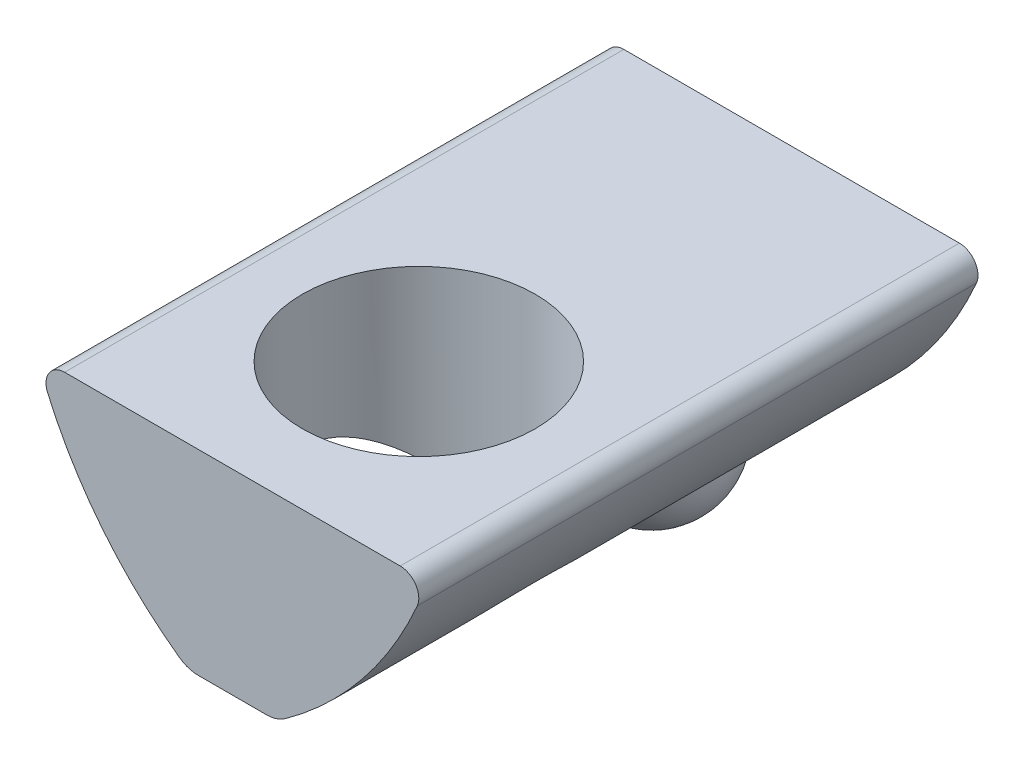
ISO-10303-21;
HEADER;
FILE_DESCRIPTION(('STEP AP214'),'2;1');
FILE_NAME('part.step','',(''),(''),'','','');
FILE_SCHEMA(('AUTOMOTIVE_DESIGN { 1 0 10303 214 1 1 1 1 }'));
ENDSEC;
DATA;
#1=APPLICATION_CONTEXT('core data for automotive mechanical design processes');
#2=APPLICATION_PROTOCOL_DEFINITION('international standard','automotive_design',2000,#1);
#3=PRODUCT_CONTEXT('',#1,'mechanical');
#4=PRODUCT('Part','Part','',(#3));
#5=PRODUCT_RELATED_PRODUCT_CATEGORY('part','',(#4));
#6=PRODUCT_DEFINITION_FORMATION('','',#4);
#7=PRODUCT_DEFINITION_CONTEXT('part definition',#1,'design');
#8=PRODUCT_DEFINITION('design','',#6,#7);
#9=PRODUCT_DEFINITION_SHAPE('','',#8);
#10=(LENGTH_UNIT() NAMED_UNIT(*) SI_UNIT(.MILLI.,.METRE.));
#11=(NAMED_UNIT(*) PLANE_ANGLE_UNIT() SI_UNIT($,.RADIAN.));
#12=(NAMED_UNIT(*) SI_UNIT($,.STERADIAN.) SOLID_ANGLE_UNIT());
#13=UNCERTAINTY_MEASURE_WITH_UNIT(LENGTH_MEASURE(1.E-05),#10,'distance_accuracy_value','');
#14=(GEOMETRIC_REPRESENTATION_CONTEXT(3) GLOBAL_UNCERTAINTY_ASSIGNED_CONTEXT((#13)) GLOBAL_UNIT_ASSIGNED_CONTEXT((#10,
#11,#12)) REPRESENTATION_CONTEXT('',''));
#15=CARTESIAN_POINT('',(0.,0.,0.));
#16=DIRECTION('',(0.,0.,1.));
#17=DIRECTION('',(1.,0.,0.));
#18=AXIS2_PLACEMENT_3D('',#15,#16,#17);
#19=CARTESIAN_POINT('',(0.,-5.8,-5.));
#20=DIRECTION('',(0.,1.,0.));
#21=DIRECTION('',(0.,0.,-1.));
#22=AXIS2_PLACEMENT_3D('',#19,#20,#21);
#23=SPHERICAL_SURFACE('',#22,1.5);
#24=CARTESIAN_POINT('',(0.,-4.3,-5.));
#25=VERTEX_POINT('',#24);
#26=VERTEX_LOOP('',#25);
#27=FACE_BOUND('',#26,.T.);
#28=ADVANCED_FACE('F75',(#27),#23,.T.);
#29=CLOSED_SHELL('',(#28));
#30=MANIFOLD_SOLID_BREP('B2',#29);
#31=CARTESIAN_POINT('',(0.729539694732656,-5.5,-8.));
#32=DIRECTION('',(0.,0.,1.));
#33=DIRECTION('',(1.,0.,0.));
#34=AXIS2_PLACEMENT_3D('',#31,#32,#33);
#35=CYLINDRICAL_SURFACE('',#34,0.7);
#36=CARTESIAN_POINT('',(1.13856682223129,-6.06806408878771,-4.02344196725738));
#37=CARTESIAN_POINT('',(1.12087567181113,-6.080793056376,-4.00281934655602));
#38=CARTESIAN_POINT('',(1.10242380755382,-6.09283271086424,-3.9824386904513));
#39=CARTESIAN_POINT('',(1.06393100401896,-6.11537318792492,-3.94225245379277));
#40=CARTESIAN_POINT('',(1.04388703798347,-6.12587096584978,-3.92244807136791));
#41=CARTESIAN_POINT('',(0.982494191238008,-6.15422148598502,-3.86520170487625));
#42=CARTESIAN_POINT('',(0.938931865057902,-6.16963488307469,-3.82880179165567));
#43=CARTESIAN_POINT('',(0.867200270241794,-6.18683298535769,-3.77567281254933));
#44=CARTESIAN_POINT('',(0.840850844026859,-6.19163000311472,-3.7574219379994));
#45=CARTESIAN_POINT('',(0.786390312292721,-6.19823393193354,-3.72224344311336));
#46=CARTESIAN_POINT('',(0.758259454629383,-6.19999726361005,-3.70533838301929));
#47=CARTESIAN_POINT('',(0.729539694732656,-6.2,-3.68936205082816));
#48=B_SPLINE_CURVE_WITH_KNOTS('',3,(#36,#37,#38,#39,#40,#41,#42,#43,#44,#45,#46,#47),
.UNSPECIFIED.,.F.,.F.,(4,2,2,2,2,4),(0.,0.0899683327155812,0.180111998412179,0.355549673500988,
0.452593574414237,0.551020235164988),.UNSPECIFIED.);
#49=CARTESIAN_POINT('',(1.13856682223129,-6.06806408878772,-4.02344196725738));
#50=VERTEX_POINT('',#49);
#51=CARTESIAN_POINT('',(0.729539694732657,-6.2,-3.68936205082816));
#52=VERTEX_POINT('',#51);
#53=EDGE_CURVE('E429',#50,#52,#48,.T.);
#54=ORIENTED_EDGE('',*,*,#53,.F.);
#55=DIRECTION('',(0.,0.,1.));
#56=VECTOR('',#55,1.);
#57=CARTESIAN_POINT('',(1.13856682223129,-6.06806408878771,-8.));
#58=LINE('',#57,#56);
#59=CARTESIAN_POINT('',(1.13856682223129,-6.06806408878771,-2.22568317406457));
#60=VERTEX_POINT('',#59);
#61=EDGE_CURVE('E233',#50,#60,#58,.T.);
#62=ORIENTED_EDGE('',*,*,#61,.T.);
#63=CARTESIAN_POINT('',(0.729539694732656,-6.2,-2.391186281704));
#64=CARTESIAN_POINT('',(0.771899444136488,-6.20001993263965,-2.37830504162167));
#65=CARTESIAN_POINT('',(0.813828852040736,-6.19615980529916,-2.36424123884122));
#66=CARTESIAN_POINT('',(0.8947916779657,-6.18142163784369,-2.33476072796751));
#67=CARTESIAN_POINT('',(0.933870253574198,-6.17071267886741,-2.31938414833751));
#68=CARTESIAN_POINT('',(1.00108764495913,-6.14595447201972,-2.2910398262126));
#69=CARTESIAN_POINT('',(1.02976860327822,-6.13312313329394,-2.2782674693626));
#70=CARTESIAN_POINT('',(1.08559646255162,-6.10352126177585,-2.2522105594569));
#71=CARTESIAN_POINT('',(1.11270363627943,-6.086680219089,-2.23892088327565));
#72=CARTESIAN_POINT('',(1.13856682223129,-6.06806408878771,-2.22568317406457));
#73=B_SPLINE_CURVE_WITH_KNOTS('',3,(#63,#64,#65,#66,#67,#68,#69,#70,#71,#72),.UNSPECIFIED.,.F.,
.F.,(4,2,2,2,4),(0.,0.132550461240486,0.261948645830981,0.363449322243431,0.466887257561466),.UNSPECIFIED.);
#74=CARTESIAN_POINT('',(0.729539694732657,-6.2,-2.391186281704));
#75=VERTEX_POINT('',#74);
#76=EDGE_CURVE('E306',#75,#60,#73,.T.);
#77=ORIENTED_EDGE('',*,*,#76,.F.);
#78=DIRECTION('',(0.,0.,1.));
#79=VECTOR('',#78,1.);
#80=CARTESIAN_POINT('',(0.729539694732657,-6.2,-8.));
#81=LINE('',#80,#79);
#82=EDGE_CURVE('E230',#52,#75,#81,.T.);
#83=ORIENTED_EDGE('',*,*,#82,.F.);
#84=EDGE_LOOP('',(#54,#62,#77,#83));
#85=FACE_BOUND('',#84,.T.);
#86=ADVANCED_FACE('F87',(#85),#35,.T.);
#87=CARTESIAN_POINT('',(-0.729539694732655,-6.2,-8.));
#88=DIRECTION('',(0.,-1.,0.));
#89=DIRECTION('',(0.,0.,-1.));
#90=AXIS2_PLACEMENT_3D('',#87,#88,#89);
#91=PLANE('',#90);
#92=CARTESIAN_POINT('',(0.,-6.2,-5.));
#93=DIRECTION('',(0.,-1.,0.));
#94=DIRECTION('',(0.,0.,-1.));
#95=AXIS2_PLACEMENT_3D('',#92,#93,#94);
#96=CIRCLE('',#95,1.5);
#97=CARTESIAN_POINT('',(-0.729539694732655,-6.2,-3.68936205082816));
#98=VERTEX_POINT('',#97);
#99=EDGE_CURVE('E214',#52,#98,#96,.T.);
#100=ORIENTED_EDGE('',*,*,#99,.F.);
#101=ORIENTED_EDGE('',*,*,#82,.T.);
#102=CARTESIAN_POINT('',(0.,-6.2,0.));
#103=DIRECTION('',(0.,-1.,0.));
#104=DIRECTION('',(0.,0.,-1.));
#105=AXIS2_PLACEMENT_3D('',#102,#103,#104);
#106=CIRCLE('',#105,2.5);
#107=CARTESIAN_POINT('',(-0.729539694732655,-6.2,-2.391186281704));
#108=VERTEX_POINT('',#107);
#109=EDGE_CURVE('E433',#108,#75,#106,.T.);
#110=ORIENTED_EDGE('',*,*,#109,.F.);
#111=DIRECTION('',(0.,0.,1.));
#112=VECTOR('',#111,1.);
#113=CARTESIAN_POINT('',(-0.729539694732655,-6.2,-8.));
#114=LINE('',#113,#112);
#115=EDGE_CURVE('E242',#98,#108,#114,.T.);
#116=ORIENTED_EDGE('',*,*,#115,.F.);
#117=EDGE_LOOP('',(#100,#101,#110,#116));
#118=FACE_BOUND('',#117,.T.);
#119=ADVANCED_FACE('F375',(#118),#91,.T.);
#120=CARTESIAN_POINT('',(-0.729539694732655,-5.5,-8.));
#121=DIRECTION('',(0.,0.,1.));
#122=DIRECTION('',(1.,0.,0.));
#123=AXIS2_PLACEMENT_3D('',#120,#121,#122);
#124=CYLINDRICAL_SURFACE('',#123,0.7);
#125=CARTESIAN_POINT('',(-0.729539694732655,-6.2,-3.68936205082816));
#126=CARTESIAN_POINT('',(-0.756121372662638,-6.19999794725344,-3.70415130713406));
#127=CARTESIAN_POINT('',(-0.782203361661127,-6.1984867692415,-3.71973589236977));
#128=CARTESIAN_POINT('',(-0.833123845193187,-6.19276684615301,-3.75227715515965));
#129=CARTESIAN_POINT('',(-0.857964625631956,-6.18856327307813,-3.76923114767705));
#130=CARTESIAN_POINT('',(-0.929267053741174,-6.17263895956863,-3.82107907399282));
#131=CARTESIAN_POINT('',(-0.973781793523615,-6.15757190837925,-3.85767704619615));
#132=CARTESIAN_POINT('',(-1.03740091182784,-6.12913788701761,-3.91615717537266));
#133=CARTESIAN_POINT('',(-1.05870175461532,-6.11823374795066,-3.93697585635663));
#134=CARTESIAN_POINT('',(-1.09982915689959,-6.0945183086322,-3.97957883864235));
#135=CARTESIAN_POINT('',(-1.11963368874477,-6.0816846525383,-4.00137201689652));
#136=CARTESIAN_POINT('',(-1.13856682223144,-6.06806408878841,-4.02344196725755));
#137=B_SPLINE_CURVE_WITH_KNOTS('',3,(#125,#126,#127,#128,#129,#130,#131,#132,#133,#134,#135,
#136),.UNSPECIFIED.,.F.,.F.,(4,2,2,2,2,4),(0.,0.0911233760989142,0.182072230070289,
0.359663421109186,0.454739707993805,0.551017262362298),.UNSPECIFIED.);
#138=CARTESIAN_POINT('',(-1.13856682223129,-6.06806408878772,-4.02344196725738));
#139=VERTEX_POINT('',#138);
#140=EDGE_CURVE('E106',#98,#139,#137,.T.);
#141=ORIENTED_EDGE('',*,*,#140,.F.);
#142=ORIENTED_EDGE('',*,*,#115,.T.);
#143=CARTESIAN_POINT('',(-1.13856682223129,-6.06806408878772,-2.22568317406457));
#144=CARTESIAN_POINT('',(-1.10447936661569,-6.09261994980356,-2.24315867129115));
#145=CARTESIAN_POINT('',(-1.06815709459361,-6.11409987715295,-2.26071471544695));
#146=CARTESIAN_POINT('',(-0.99293918490971,-6.149853003805,-2.29470901782229));
#147=CARTESIAN_POINT('',(-0.954129477136599,-6.16429139696956,-2.31116418646768));
#148=CARTESIAN_POINT('',(-0.884660739899766,-6.18327717559767,-2.33845691996072));
#149=CARTESIAN_POINT('',(-0.854566999152261,-6.18943170709808,-2.34962763389479));
#150=CARTESIAN_POINT('',(-0.792917760539238,-6.19783316486227,-2.37115564473916));
#151=CARTESIAN_POINT('',(-0.761345481405494,-6.20000523427743,-2.38149393375453));
#152=CARTESIAN_POINT('',(-0.729539694732655,-6.2,-2.391186281704));
#153=B_SPLINE_CURVE_WITH_KNOTS('',3,(#143,#144,#145,#146,#147,#148,#149,#150,#151,#152),
.UNSPECIFIED.,.F.,.F.,(4,2,2,2,4),(0.,0.136428411265986,0.269480549330731,0.367275941509058,
0.466891419491656),.UNSPECIFIED.);
#154=CARTESIAN_POINT('',(-1.13856682223129,-6.06806408878771,-2.22568317406457));
#155=VERTEX_POINT('',#154);
#156=EDGE_CURVE('E292',#155,#108,#153,.T.);
#157=ORIENTED_EDGE('',*,*,#156,.F.);
#158=DIRECTION('',(0.,0.,1.));
#159=VECTOR('',#158,1.);
#160=CARTESIAN_POINT('',(-1.13856682223129,-6.06806408878772,-8.));
#161=LINE('',#160,#159);
#162=EDGE_CURVE('E252',#139,#155,#161,.T.);
#163=ORIENTED_EDGE('',*,*,#162,.F.);
#164=EDGE_LOOP('',(#141,#142,#157,#163));
#165=FACE_BOUND('',#164,.T.);
#166=ADVANCED_FACE('F366',(#165),#124,.T.);
#167=CARTESIAN_POINT('',(1.13856682223129,-6.06806408878771,2.22568317406457));
#168=CARTESIAN_POINT('',(1.1044793666157,-6.09261994980356,2.24315867129115));
#169=CARTESIAN_POINT('',(1.06815709459361,-6.11409987715295,2.26071471544695));
#170=CARTESIAN_POINT('',(0.992939184909715,-6.149853003805,2.29470901782229));
#171=CARTESIAN_POINT('',(0.954129477136604,-6.16429139696956,2.31116418646768));
#172=CARTESIAN_POINT('',(0.884660739899771,-6.18327717559767,2.33845691996072));
#173=CARTESIAN_POINT('',(0.854566999152265,-6.18943170709808,2.34962763389479));
#174=CARTESIAN_POINT('',(0.79291776053924,-6.19783316486227,2.37115564473916));
#175=CARTESIAN_POINT('',(0.761345481405496,-6.20000523427743,2.38149393375453));
#176=CARTESIAN_POINT('',(0.729539694732656,-6.2,2.391186281704));
#177=B_SPLINE_CURVE_WITH_KNOTS('',3,(#167,#168,#169,#170,#171,#172,#173,#174,#175,#176),
.UNSPECIFIED.,.F.,.F.,(4,2,2,2,4),(0.,0.136428411265988,0.269480549330732,0.367275941509061,
0.466891419491662),.UNSPECIFIED.);
#178=CARTESIAN_POINT('',(1.13856682223129,-6.06806408878771,2.22568317406457));
#179=VERTEX_POINT('',#178);
#180=CARTESIAN_POINT('',(0.729539694732657,-6.2,2.391186281704));
#181=VERTEX_POINT('',#180);
#182=EDGE_CURVE('E313',#179,#181,#177,.T.);
#183=ORIENTED_EDGE('',*,*,#182,.F.);
#184=CARTESIAN_POINT('',(1.13856682223129,-6.06806408878771,4.));
#185=VERTEX_POINT('',#184);
#186=EDGE_CURVE('E229',#179,#185,#58,.T.);
#187=ORIENTED_EDGE('',*,*,#186,.T.);
#188=CARTESIAN_POINT('',(0.729539694732656,-5.5,4.));
#189=DIRECTION('',(0.,0.,1.));
#190=DIRECTION('',(1.,0.,0.));
#191=AXIS2_PLACEMENT_3D('',#188,#189,#190);
#192=CIRCLE('',#191,0.7);
#193=CARTESIAN_POINT('',(0.729539694732657,-6.2,4.));
#194=VERTEX_POINT('',#193);
#195=EDGE_CURVE('E407',#194,#185,#192,.T.);
#196=ORIENTED_EDGE('',*,*,#195,.F.);
#197=EDGE_CURVE('E232',#181,#194,#81,.T.);
#198=ORIENTED_EDGE('',*,*,#197,.F.);
#199=EDGE_LOOP('',(#183,#187,#196,#198));
#200=FACE_BOUND('',#199,.T.);
#201=ADVANCED_FACE('F329',(#200),#35,.T.);
#202=CARTESIAN_POINT('',(-0.729539694732655,-6.2,2.391186281704));
#203=VERTEX_POINT('',#202);
#204=EDGE_CURVE('E434',#181,#203,#106,.T.);
#205=ORIENTED_EDGE('',*,*,#204,.F.);
#206=ORIENTED_EDGE('',*,*,#197,.T.);
#207=DIRECTION('',(1.,0.,0.));
#208=VECTOR('',#207,1.);
#209=CARTESIAN_POINT('',(-0.729539694732655,-6.2,4.));
#210=LINE('',#209,#208);
#211=CARTESIAN_POINT('',(-0.729539694732655,-6.2,4.));
#212=VERTEX_POINT('',#211);
#213=EDGE_CURVE('E412',#212,#194,#210,.T.);
#214=ORIENTED_EDGE('',*,*,#213,.F.);
#215=EDGE_CURVE('E243',#203,#212,#114,.T.);
#216=ORIENTED_EDGE('',*,*,#215,.F.);
#217=EDGE_LOOP('',(#205,#206,#214,#216));
#218=FACE_BOUND('',#217,.T.);
#219=ADVANCED_FACE('F376',(#218),#91,.T.);
#220=CARTESIAN_POINT('',(-0.729539694732655,-6.2,2.391186281704));
#221=CARTESIAN_POINT('',(-0.771899444136487,-6.20001993263965,2.37830504162167));
#222=CARTESIAN_POINT('',(-0.813828852040734,-6.19615980529916,2.36424123884122));
#223=CARTESIAN_POINT('',(-0.894791677965698,-6.18142163784369,2.33476072796751));
#224=CARTESIAN_POINT('',(-0.933870253574197,-6.17071267886741,2.31938414833751));
#225=CARTESIAN_POINT('',(-1.00108764495913,-6.14595447201972,2.2910398262126));
#226=CARTESIAN_POINT('',(-1.02976860327822,-6.13312313329394,2.2782674693626));
#227=CARTESIAN_POINT('',(-1.08559646255162,-6.10352126177585,2.25221055945691));
#228=CARTESIAN_POINT('',(-1.11270363627943,-6.086680219089,2.23892088327565));
#229=CARTESIAN_POINT('',(-1.13856682223129,-6.06806408878772,2.22568317406457));
#230=B_SPLINE_CURVE_WITH_KNOTS('',3,(#220,#221,#222,#223,#224,#225,#226,#227,#228,#229),
.UNSPECIFIED.,.F.,.F.,(4,2,2,2,4),(0.,0.132550461240485,0.26194864583098,0.363449322243428,
0.466887257561461),.UNSPECIFIED.);
#231=CARTESIAN_POINT('',(-1.13856682223129,-6.06806408878772,2.22568317406457));
#232=VERTEX_POINT('',#231);
#233=EDGE_CURVE('E114',#203,#232,#230,.T.);
#234=ORIENTED_EDGE('',*,*,#233,.F.);
#235=ORIENTED_EDGE('',*,*,#215,.T.);
#236=CARTESIAN_POINT('',(-0.729539694732655,-5.5,4.));
#237=DIRECTION('',(0.,0.,1.));
#238=DIRECTION('',(-1.,0.,0.));
#239=AXIS2_PLACEMENT_3D('',#236,#237,#238);
#240=CIRCLE('',#239,0.7);
#241=CARTESIAN_POINT('',(-1.13856682223129,-6.06806408878772,4.));
#242=VERTEX_POINT('',#241);
#243=EDGE_CURVE('E414',#242,#212,#240,.T.);
#244=ORIENTED_EDGE('',*,*,#243,.F.);
#245=EDGE_CURVE('E253',#232,#242,#161,.T.);
#246=ORIENTED_EDGE('',*,*,#245,.F.);
#247=EDGE_LOOP('',(#234,#235,#244,#246));
#248=FACE_BOUND('',#247,.T.);
#249=ADVANCED_FACE('F367',(#248),#124,.T.);
#250=CARTESIAN_POINT('',(-3.6,-2.4,-8.));
#251=DIRECTION('',(0.,0.,1.));
#252=DIRECTION('',(1.,0.,0.));
#253=AXIS2_PLACEMENT_3D('',#250,#251,#252);
#254=CYLINDRICAL_SURFACE('',#253,0.399999999999999);
#255=CARTESIAN_POINT('',(-3.6,-2.4,4.));
#256=DIRECTION('',(0.,0.,1.));
#257=DIRECTION('',(-1.,0.,0.));
#258=AXIS2_PLACEMENT_3D('',#255,#256,#257);
#259=CIRCLE('',#258,0.399999999999999);
#260=CARTESIAN_POINT('',(-3.6,-2.,4.));
#261=VERTEX_POINT('',#260);
#262=CARTESIAN_POINT('',(-3.96682425454508,-2.55949911058513,4.));
#263=VERTEX_POINT('',#262);
#264=EDGE_CURVE('E456',#261,#263,#259,.T.);
#265=ORIENTED_EDGE('',*,*,#264,.F.);
#266=DIRECTION('',(0.,0.,1.));
#267=VECTOR('',#266,1.);
#268=CARTESIAN_POINT('',(-3.6,-2.,-8.));
#269=LINE('',#268,#267);
#270=CARTESIAN_POINT('',(-3.6,-2.,-8.));
#271=VERTEX_POINT('',#270);
#272=EDGE_CURVE('E272',#271,#261,#269,.T.);
#273=ORIENTED_EDGE('',*,*,#272,.F.);
#274=CARTESIAN_POINT('',(-3.6,-2.4,-8.));
#275=DIRECTION('',(0.,0.,1.));
#276=DIRECTION('',(-1.,0.,0.));
#277=AXIS2_PLACEMENT_3D('',#274,#275,#276);
#278=CIRCLE('',#277,0.399999999999999);
#279=CARTESIAN_POINT('',(-3.96682425454508,-2.55949911058513,-8.));
#280=VERTEX_POINT('',#279);
#281=EDGE_CURVE('E422',#271,#280,#278,.T.);
#282=ORIENTED_EDGE('',*,*,#281,.T.);
#283=DIRECTION('',(0.,0.,1.));
#284=VECTOR('',#283,1.);
#285=CARTESIAN_POINT('',(-3.96682425454508,-2.55949911058513,-8.));
#286=LINE('',#285,#284);
#287=EDGE_CURVE('E257',#280,#263,#286,.T.);
#288=ORIENTED_EDGE('',*,*,#287,.T.);
#289=EDGE_LOOP('',(#265,#273,#282,#288));
#290=FACE_BOUND('',#289,.T.);
#291=ADVANCED_FACE('F89',(#290),#254,.T.);
#292=CARTESIAN_POINT('',(-3.6,-2.,-8.));
#293=DIRECTION('',(0.,1.,0.));
#294=DIRECTION('',(-1.,0.,0.));
#295=AXIS2_PLACEMENT_3D('',#292,#293,#294);
#296=PLANE('',#295);
#297=CARTESIAN_POINT('',(0.,-2.,0.));
#298=DIRECTION('',(0.,1.,0.));
#299=DIRECTION('',(-1.,0.,0.));
#300=AXIS2_PLACEMENT_3D('',#297,#298,#299);
#301=CIRCLE('',#300,2.5);
#302=CARTESIAN_POINT('',(-2.5,-2.,0.));
#303=VERTEX_POINT('',#302);
#304=EDGE_CURVE('E459',#303,#303,#301,.T.);
#305=ORIENTED_EDGE('',*,*,#304,.F.);
#306=EDGE_LOOP('',(#305));
#307=FACE_BOUND('',#306,.T.);
#308=DIRECTION('',(-1.,0.,0.));
#309=VECTOR('',#308,1.);
#310=CARTESIAN_POINT('',(-3.6,-2.,4.));
#311=LINE('',#310,#309);
#312=CARTESIAN_POINT('',(3.6,-2.,4.));
#313=VERTEX_POINT('',#312);
#314=EDGE_CURVE('E419',#313,#261,#311,.T.);
#315=ORIENTED_EDGE('',*,*,#314,.F.);
#316=DIRECTION('',(0.,0.,1.));
#317=VECTOR('',#316,1.);
#318=CARTESIAN_POINT('',(3.6,-2.,-8.));
#319=LINE('',#318,#317);
#320=CARTESIAN_POINT('',(3.6,-2.,-8.));
#321=VERTEX_POINT('',#320);
#322=EDGE_CURVE('E424',#321,#313,#319,.T.);
#323=ORIENTED_EDGE('',*,*,#322,.F.);
#324=DIRECTION('',(-1.,0.,0.));
#325=VECTOR('',#324,1.);
#326=CARTESIAN_POINT('',(-3.6,-2.,-8.));
#327=LINE('',#326,#325);
#328=EDGE_CURVE('E260',#321,#271,#327,.T.);
#329=ORIENTED_EDGE('',*,*,#328,.T.);
#330=ORIENTED_EDGE('',*,*,#272,.T.);
#331=EDGE_LOOP('',(#315,#323,#329,#330));
#332=FACE_BOUND('',#331,.T.);
#333=ADVANCED_FACE('F469',(#307,#332),#296,.T.);
#334=CARTESIAN_POINT('',(3.6,-2.4,-8.));
#335=DIRECTION('',(0.,0.,1.));
#336=DIRECTION('',(1.,0.,0.));
#337=AXIS2_PLACEMENT_3D('',#334,#335,#336);
#338=CYLINDRICAL_SURFACE('',#337,0.399999999999999);
#339=CARTESIAN_POINT('',(3.6,-2.4,4.));
#340=DIRECTION('',(0.,0.,1.));
#341=DIRECTION('',(1.,0.,0.));
#342=AXIS2_PLACEMENT_3D('',#339,#340,#341);
#343=CIRCLE('',#342,0.399999999999999);
#344=CARTESIAN_POINT('',(3.96682425454508,-2.55949911058513,4.));
#345=VERTEX_POINT('',#344);
#346=EDGE_CURVE('E406',#345,#313,#343,.T.);
#347=ORIENTED_EDGE('',*,*,#346,.F.);
#348=DIRECTION('',(0.,0.,1.));
#349=VECTOR('',#348,1.);
#350=CARTESIAN_POINT('',(3.96682425454508,-2.55949911058513,-8.));
#351=LINE('',#350,#349);
#352=CARTESIAN_POINT('',(3.96682425454508,-2.55949911058513,-8.));
#353=VERTEX_POINT('',#352);
#354=EDGE_CURVE('E402',#353,#345,#351,.T.);
#355=ORIENTED_EDGE('',*,*,#354,.F.);
#356=CARTESIAN_POINT('',(3.6,-2.4,-8.));
#357=DIRECTION('',(0.,0.,1.));
#358=DIRECTION('',(1.,0.,0.));
#359=AXIS2_PLACEMENT_3D('',#356,#357,#358);
#360=CIRCLE('',#359,0.399999999999999);
#361=EDGE_CURVE('E265',#353,#321,#360,.T.);
#362=ORIENTED_EDGE('',*,*,#361,.T.);
#363=ORIENTED_EDGE('',*,*,#322,.T.);
#364=EDGE_LOOP('',(#347,#355,#362,#363));
#365=FACE_BOUND('',#364,.T.);
#366=ADVANCED_FACE('F472',(#365),#338,.T.);
#367=CARTESIAN_POINT('',(-3.82819115453788,0.829856989348781,-8.));
#368=DIRECTION('',(0.,0.,1.));
#369=DIRECTION('',(1.,0.,0.));
#370=AXIS2_PLACEMENT_3D('',#367,#368,#369);
#371=CYLINDRICAL_SURFACE('',#370,8.5);
#372=CARTESIAN_POINT('',(1.13856682223129,-6.06806408878772,-5.97655803274262));
#373=CARTESIAN_POINT('',(1.18629220642727,-6.03371493630984,-5.92095251331803));
#374=CARTESIAN_POINT('',(1.23057852376887,-6.00105789697383,-5.86102510096801));
#375=CARTESIAN_POINT('',(1.31100840472356,-5.94075093687342,-5.73281809088279));
#376=CARTESIAN_POINT('',(1.34707479090851,-5.91314891656651,-5.66446792919564));
#377=CARTESIAN_POINT('',(1.40906041392535,-5.86512353626786,-5.52031848190846));
#378=CARTESIAN_POINT('',(1.43491849806139,-5.84474351181313,-5.44447760749966));
#379=CARTESIAN_POINT('',(1.47427542592308,-5.81352278859679,-5.28804610718092));
#380=CARTESIAN_POINT('',(1.48782713558289,-5.80264129378116,-5.20747739623729));
#381=CARTESIAN_POINT('',(1.50067218856285,-5.79232307052847,-5.05516973785821));
#382=CARTESIAN_POINT('',(1.50159863081322,-5.791575569592,-4.98365422805466));
#383=CARTESIAN_POINT('',(1.49330619003308,-5.79824185761161,-4.84157417205287));
#384=CARTESIAN_POINT('',(1.48408362287867,-5.80565861021894,-4.77100998060138));
#385=CARTESIAN_POINT('',(1.45711327800749,-5.82715606534904,-4.63790330993276));
#386=CARTESIAN_POINT('',(1.44000668106208,-5.84073455702776,-4.57514492928017));
#387=CARTESIAN_POINT('',(1.39840902532839,-5.87337719261371,-4.45356917653843));
#388=CARTESIAN_POINT('',(1.37390815082993,-5.89244862671269,-4.39475717079456));
#389=CARTESIAN_POINT('',(1.31767503930652,-5.93559519501479,-4.28033392770202));
#390=CARTESIAN_POINT('',(1.28575101424958,-5.95980119714242,-4.2248680460892));
#391=CARTESIAN_POINT('',(1.21620188620513,-6.01163391632849,-4.11976742201475));
#392=CARTESIAN_POINT('',(1.17860269208387,-6.03924498842905,-4.07010791239759));
#393=CARTESIAN_POINT('',(1.13856682223129,-6.06806408878772,-4.02344196725738));
#394=B_SPLINE_CURVE_WITH_KNOTS('',3,(#372,#373,#374,#375,#376,#377,#378,#379,#380,#381,#382,
#383,#384,#385,#386,#387,#388,#389,#390,#391,#392,#393),.UNSPECIFIED.,.F.,.F.,(4,2,2,2,2,2,2,2,
2,2,4),(0.,0.242931133054103,0.488056945212267,0.734629673027259,0.980138088655173,
1.19353501332418,1.40700942734097,1.6055574775279,1.80437026312313,2.0090406296994,
2.21280339726921),.UNSPECIFIED.);
#395=CARTESIAN_POINT('',(1.13856682223129,-6.06806408878771,-5.97655803274262));
#396=VERTEX_POINT('',#395);
#397=EDGE_CURVE('E223',#396,#50,#394,.T.);
#398=ORIENTED_EDGE('',*,*,#397,.F.);
#399=CARTESIAN_POINT('',(1.13856682223129,-6.06806408878771,-8.));
#400=VERTEX_POINT('',#399);
#401=EDGE_CURVE('E222',#400,#396,#58,.T.);
#402=ORIENTED_EDGE('',*,*,#401,.F.);
#403=CARTESIAN_POINT('',(-3.82819115453788,0.829856989348781,-8.));
#404=DIRECTION('',(0.,0.,1.));
#405=DIRECTION('',(1.,0.,0.));
#406=AXIS2_PLACEMENT_3D('',#403,#404,#405);
#407=CIRCLE('',#406,8.5);
#408=EDGE_CURVE('E442',#400,#353,#407,.T.);
#409=ORIENTED_EDGE('',*,*,#408,.T.);
#410=ORIENTED_EDGE('',*,*,#354,.T.);
#411=CARTESIAN_POINT('',(-3.82819115453788,0.829856989348781,4.));
#412=DIRECTION('',(0.,0.,1.));
#413=DIRECTION('',(1.,0.,0.));
#414=AXIS2_PLACEMENT_3D('',#411,#412,#413);
#415=CIRCLE('',#414,8.5);
#416=EDGE_CURVE('E399',#185,#345,#415,.T.);
#417=ORIENTED_EDGE('',*,*,#416,.F.);
#418=ORIENTED_EDGE('',*,*,#186,.F.);
#419=CARTESIAN_POINT('',(1.13856682223129,-6.06806408878772,-2.22568317406457));
#420=CARTESIAN_POINT('',(1.21790019011694,-6.01095937509882,-2.18507359427236));
#421=CARTESIAN_POINT('',(1.29485422409949,-5.95345382730739,-2.14037898686232));
#422=CARTESIAN_POINT('',(1.44370608384542,-5.83841826464445,-2.04295551417095));
#423=CARTESIAN_POINT('',(1.51559628796477,-5.78088833869324,-1.99021490111173));
#424=CARTESIAN_POINT('',(1.65455011278308,-5.66612409912983,-1.87633040835246));
#425=CARTESIAN_POINT('',(1.72155162161692,-5.60890007661709,-1.81510011215352));
#426=CARTESIAN_POINT('',(1.84927133782213,-5.49656756817711,-1.68478894410064));
#427=CARTESIAN_POINT('',(1.90999446156737,-5.44145744853145,-1.615714305187));
#428=CARTESIAN_POINT('',(2.04083476582881,-5.31950166778189,-1.44886515104495));
#429=CARTESIAN_POINT('',(2.10873562821262,-5.25375758732549,-1.34850552015501));
#430=CARTESIAN_POINT('',(2.2309506004413,-5.13203962042749,-1.13486394479421));
#431=CARTESIAN_POINT('',(2.28531777188512,-5.07602784615295,-1.02163508597492));
#432=CARTESIAN_POINT('',(2.36711358523631,-4.99001316961914,-0.810237508847494));
#433=CARTESIAN_POINT('',(2.39786252284564,-4.95699119475986,-0.714603604779679));
#434=CARTESIAN_POINT('',(2.44802735710502,-4.90254784426205,-0.517204545815897));
#435=CARTESIAN_POINT('',(2.46745313703353,-4.881116353196,-0.41544482362876));
#436=CARTESIAN_POINT('',(2.49358666494308,-4.85217891213109,-0.207519359830732));
#437=CARTESIAN_POINT('',(2.50020165451772,-4.84477453584947,-0.101327129051279));
#438=CARTESIAN_POINT('',(2.49978899250387,-4.84523498851491,0.110998235412221));
#439=CARTESIAN_POINT('',(2.4927622385174,-4.85309881284202,0.217131372524899));
#440=CARTESIAN_POINT('',(2.46720182210912,-4.88138818620457,0.414434358829413));
#441=CARTESIAN_POINT('',(2.4499756079011,-4.90038424020492,0.505992676252127));
#442=CARTESIAN_POINT('',(2.40628753695172,-4.94788612863037,0.684262875292913));
#443=CARTESIAN_POINT('',(2.37982157869491,-4.97639618606592,0.770972584753375));
#444=CARTESIAN_POINT('',(2.30420347973126,-5.05639912158567,0.978811750624651));
#445=CARTESIAN_POINT('',(2.25026022254428,-5.11235423991464,1.0964759124973));
#446=CARTESIAN_POINT('',(2.12802944864247,-5.234874379515,1.31818348166594));
#447=CARTESIAN_POINT('',(2.05969734086896,-5.30147222420597,1.42218287565008));
#448=CARTESIAN_POINT('',(1.88551025903057,-5.46476658710164,1.6498039236081));
#449=CARTESIAN_POINT('',(1.77482234926036,-5.56395477660891,1.76793053391968));
#450=CARTESIAN_POINT('',(1.535402057071,-5.76607863379593,1.97939044587258));
#451=CARTESIAN_POINT('',(1.40670269582358,-5.86900719402356,2.07276823383417));
#452=CARTESIAN_POINT('',(1.22709215443997,-6.00366922134726,2.17869882226621));
#453=CARTESIAN_POINT('',(1.18319784313193,-6.03593644243553,2.20284320065487));
#454=CARTESIAN_POINT('',(1.13856682223129,-6.06806408878772,2.22568317406457));
#455=B_SPLINE_CURVE_WITH_KNOTS('',3,(#419,#420,#421,#422,#423,#424,#425,#426,#427,#428,#429,
#430,#431,#432,#433,#434,#435,#436,#437,#438,#439,#440,#441,#442,#443,#444,#445,#446,#447,#448,
#449,#450,#451,#452,#453,#454),.UNSPECIFIED.,.F.,.F.,(4,2,2,2,2,2,2,2,2,2,2,2,2,2,2,2,2,4),(0.,
0.317438937280813,0.635345875507433,0.956765692570335,1.27793188032014,1.69013686832645,
2.10069932464098,2.41673446373879,2.73249334080016,3.05053009199043,3.3685459176477,
3.6526377127353,3.93685577663959,4.35755005050141,4.77956776581712,5.34625637327246,
5.91191933420965,6.09060427748178),.UNSPECIFIED.);
#456=EDGE_CURVE('E318',#60,#179,#455,.T.);
#457=ORIENTED_EDGE('',*,*,#456,.F.);
#458=ORIENTED_EDGE('',*,*,#61,.F.);
#459=EDGE_LOOP('',(#398,#402,#409,#410,#417,#418,#457,#458));
#460=FACE_BOUND('',#459,.T.);
#461=ADVANCED_FACE('F328',(#460),#371,.T.);
#462=CARTESIAN_POINT('',(0.729539694732656,-6.2,-6.31063794917185));
#463=CARTESIAN_POINT('',(0.756121372662639,-6.19999794725344,-6.29584869286594));
#464=CARTESIAN_POINT('',(0.782203361661128,-6.1984867692415,-6.28026410763023));
#465=CARTESIAN_POINT('',(0.833123845193187,-6.19276684615301,-6.24772284484035));
#466=CARTESIAN_POINT('',(0.857964625631957,-6.18856327307813,-6.23076885232295));
#467=CARTESIAN_POINT('',(0.929267053741175,-6.17263895956863,-6.17892092600718));
#468=CARTESIAN_POINT('',(0.973781793523616,-6.15757190837925,-6.14232295380385));
#469=CARTESIAN_POINT('',(1.03740091182784,-6.12913788701761,-6.08384282462734));
#470=CARTESIAN_POINT('',(1.05870175461532,-6.11823374795066,-6.06302414364337));
#471=CARTESIAN_POINT('',(1.09982915689959,-6.0945183086322,-6.02042116135764));
#472=CARTESIAN_POINT('',(1.11963368874478,-6.0816846525383,-5.99862798310348));
#473=CARTESIAN_POINT('',(1.13856682223144,-6.0680640887884,-5.97655803274245));
#474=B_SPLINE_CURVE_WITH_KNOTS('',3,(#462,#463,#464,#465,#466,#467,#468,#469,#470,#471,#472,
#473),.UNSPECIFIED.,.F.,.F.,(4,2,2,2,2,4),(0.,0.0911233760989138,0.182072230070289,
0.359663421109186,0.454739707993807,0.551017262362305),.UNSPECIFIED.);
#475=CARTESIAN_POINT('',(0.729539694732657,-6.2,-6.31063794917185));
#476=VERTEX_POINT('',#475);
#477=EDGE_CURVE('E207',#476,#396,#474,.T.);
#478=ORIENTED_EDGE('',*,*,#477,.F.);
#479=CARTESIAN_POINT('',(0.729539694732657,-6.2,-8.));
#480=VERTEX_POINT('',#479);
#481=EDGE_CURVE('E220',#480,#476,#81,.T.);
#482=ORIENTED_EDGE('',*,*,#481,.F.);
#483=CARTESIAN_POINT('',(0.729539694732656,-5.5,-8.));
#484=DIRECTION('',(0.,0.,1.));
#485=DIRECTION('',(1.,0.,0.));
#486=AXIS2_PLACEMENT_3D('',#483,#484,#485);
#487=CIRCLE('',#486,0.7);
#488=EDGE_CURVE('E446',#480,#400,#487,.T.);
#489=ORIENTED_EDGE('',*,*,#488,.T.);
#490=ORIENTED_EDGE('',*,*,#401,.T.);
#491=EDGE_LOOP('',(#478,#482,#489,#490));
#492=FACE_BOUND('',#491,.T.);
#493=ADVANCED_FACE('F218',(#492),#35,.T.);
#494=CARTESIAN_POINT('',(-0.729539694732655,-6.2,-6.31063794917185));
#495=VERTEX_POINT('',#494);
#496=EDGE_CURVE('E203',#495,#476,#96,.T.);
#497=ORIENTED_EDGE('',*,*,#496,.F.);
#498=CARTESIAN_POINT('',(-0.729539694732655,-6.2,-8.));
#499=VERTEX_POINT('',#498);
#500=EDGE_CURVE('E236',#499,#495,#114,.T.);
#501=ORIENTED_EDGE('',*,*,#500,.F.);
#502=DIRECTION('',(1.,0.,0.));
#503=VECTOR('',#502,1.);
#504=CARTESIAN_POINT('',(-0.729539694732655,-6.2,-8.));
#505=LINE('',#504,#503);
#506=EDGE_CURVE('E228',#499,#480,#505,.T.);
#507=ORIENTED_EDGE('',*,*,#506,.T.);
#508=ORIENTED_EDGE('',*,*,#481,.T.);
#509=EDGE_LOOP('',(#497,#501,#507,#508));
#510=FACE_BOUND('',#509,.T.);
#511=ADVANCED_FACE('F226',(#510),#91,.T.);
#512=CARTESIAN_POINT('',(-1.13856682223129,-6.06806408878772,-5.97655803274262));
#513=CARTESIAN_POINT('',(-1.12087567181112,-6.080793056376,-5.99718065344398));
#514=CARTESIAN_POINT('',(-1.10242380755382,-6.09283271086424,-6.01756130954871));
#515=CARTESIAN_POINT('',(-1.06393100401896,-6.11537318792493,-6.05774754620723));
#516=CARTESIAN_POINT('',(-1.04388703798346,-6.12587096584979,-6.0775519286321));
#517=CARTESIAN_POINT('',(-0.982494191238001,-6.15422148598502,-6.13479829512376));
#518=CARTESIAN_POINT('',(-0.938931865057895,-6.16963488307469,-6.17119820834433));
#519=CARTESIAN_POINT('',(-0.867200270241788,-6.18683298535769,-6.22432718745068));
#520=CARTESIAN_POINT('',(-0.840850844026854,-6.19163000311473,-6.24257806200061));
#521=CARTESIAN_POINT('',(-0.786390312292718,-6.19823393193354,-6.27775655688665));
#522=CARTESIAN_POINT('',(-0.758259454629381,-6.19999726361005,-6.29466161698071));
#523=CARTESIAN_POINT('',(-0.729539694732655,-6.2,-6.31063794917185));
#524=B_SPLINE_CURVE_WITH_KNOTS('',3,(#512,#513,#514,#515,#516,#517,#518,#519,#520,#521,#522,
#523),.UNSPECIFIED.,.F.,.F.,(4,2,2,2,2,4),(0.,0.0899683327155815,0.18011199841218,
0.355549673500989,0.452593574414233,0.551020235164981),.UNSPECIFIED.);
#525=CARTESIAN_POINT('',(-1.13856682223129,-6.06806408878771,-5.97655803274262));
#526=VERTEX_POINT('',#525);
#527=EDGE_CURVE('E210',#526,#495,#524,.T.);
#528=ORIENTED_EDGE('',*,*,#527,.F.);
#529=CARTESIAN_POINT('',(-1.13856682223129,-6.06806408878772,-8.));
#530=VERTEX_POINT('',#529);
#531=EDGE_CURVE('E247',#530,#526,#161,.T.);
#532=ORIENTED_EDGE('',*,*,#531,.F.);
#533=CARTESIAN_POINT('',(-0.729539694732655,-5.5,-8.));
#534=DIRECTION('',(0.,0.,1.));
#535=DIRECTION('',(-1.,0.,0.));
#536=AXIS2_PLACEMENT_3D('',#533,#534,#535);
#537=CIRCLE('',#536,0.7);
#538=EDGE_CURVE('E451',#530,#499,#537,.T.);
#539=ORIENTED_EDGE('',*,*,#538,.T.);
#540=ORIENTED_EDGE('',*,*,#500,.T.);
#541=EDGE_LOOP('',(#528,#532,#539,#540));
#542=FACE_BOUND('',#541,.T.);
#543=ADVANCED_FACE('F363',(#542),#124,.T.);
#544=CARTESIAN_POINT('',(3.82819115453788,0.829856989348782,-8.));
#545=DIRECTION('',(0.,0.,1.));
#546=DIRECTION('',(1.,0.,0.));
#547=AXIS2_PLACEMENT_3D('',#544,#545,#546);
#548=CYLINDRICAL_SURFACE('',#547,8.5);
#549=CARTESIAN_POINT('',(-1.13856682223129,-6.06806408878771,-4.02344196725738));
#550=CARTESIAN_POINT('',(-1.18629220642727,-6.03371493630984,-4.07904748668197));
#551=CARTESIAN_POINT('',(-1.23057852376887,-6.00105789697383,-4.138974899032));
#552=CARTESIAN_POINT('',(-1.31100840472357,-5.94075093687341,-4.26718190911721));
#553=CARTESIAN_POINT('',(-1.34707479090852,-5.91314891656651,-4.33553207080436));
#554=CARTESIAN_POINT('',(-1.40906041392536,-5.86512353626785,-4.47968151809155));
#555=CARTESIAN_POINT('',(-1.4349184980614,-5.84474351181313,-4.55552239250035));
#556=CARTESIAN_POINT('',(-1.47427542592308,-5.81352278859678,-4.71195389281908));
#557=CARTESIAN_POINT('',(-1.48782713558289,-5.80264129378116,-4.79252260376272));
#558=CARTESIAN_POINT('',(-1.50067218856285,-5.79232307052847,-4.94483026214179));
#559=CARTESIAN_POINT('',(-1.50159863081322,-5.791575569592,-5.01634577194535));
#560=CARTESIAN_POINT('',(-1.49330619003308,-5.79824185761161,-5.15842582794714));
#561=CARTESIAN_POINT('',(-1.48408362287867,-5.80565861021894,-5.22899001939862));
#562=CARTESIAN_POINT('',(-1.45711327800749,-5.82715606534904,-5.36209669006725));
#563=CARTESIAN_POINT('',(-1.44000668106208,-5.84073455702776,-5.42485507071984));
#564=CARTESIAN_POINT('',(-1.39840902532839,-5.87337719261371,-5.54643082346157));
#565=CARTESIAN_POINT('',(-1.37390815082993,-5.89244862671269,-5.60524282920544));
#566=CARTESIAN_POINT('',(-1.31767503930652,-5.93559519501479,-5.71966607229798));
#567=CARTESIAN_POINT('',(-1.28575101424958,-5.95980119714242,-5.7751319539108));
#568=CARTESIAN_POINT('',(-1.21620188620513,-6.01163391632849,-5.88023257798525));
#569=CARTESIAN_POINT('',(-1.17860269208387,-6.03924498842905,-5.92989208760241));
#570=CARTESIAN_POINT('',(-1.13856682223129,-6.06806408878771,-5.97655803274262));
#571=B_SPLINE_CURVE_WITH_KNOTS('',3,(#549,#550,#551,#552,#553,#554,#555,#556,#557,#558,#559,
#560,#561,#562,#563,#564,#565,#566,#567,#568,#569,#570),.UNSPECIFIED.,.F.,.F.,(4,2,2,2,2,2,2,2,
2,2,4),(0.,0.242931133054102,0.488056945212267,0.734629673027258,0.980138088655172,
1.19353501332418,1.40700942734097,1.6055574775279,1.80437026312313,2.0090406296994,
2.2128033972692),.UNSPECIFIED.);
#572=EDGE_CURVE('E73',#139,#526,#571,.T.);
#573=ORIENTED_EDGE('',*,*,#572,.F.);
#574=ORIENTED_EDGE('',*,*,#162,.T.);
#575=CARTESIAN_POINT('',(-1.13856682223129,-6.06806408878771,2.22568317406457));
#576=CARTESIAN_POINT('',(-1.21790019011694,-6.01095937509882,2.18507359427236));
#577=CARTESIAN_POINT('',(-1.2948542240995,-5.95345382730738,2.14037898686232));
#578=CARTESIAN_POINT('',(-1.44370608384542,-5.83841826464444,2.04295551417095));
#579=CARTESIAN_POINT('',(-1.51559628796477,-5.78088833869324,1.99021490111173));
#580=CARTESIAN_POINT('',(-1.65455011278308,-5.66612409912982,1.87633040835246));
#581=CARTESIAN_POINT('',(-1.72155162161692,-5.60890007661709,1.81510011215351));
#582=CARTESIAN_POINT('',(-1.84927133782213,-5.49656756817711,1.68478894410064));
#583=CARTESIAN_POINT('',(-1.90999446156737,-5.44145744853145,1.615714305187));
#584=CARTESIAN_POINT('',(-2.04083476582881,-5.31950166778189,1.44886515104495));
#585=CARTESIAN_POINT('',(-2.10873562821262,-5.25375758732549,1.348505520155));
#586=CARTESIAN_POINT('',(-2.2309506004413,-5.13203962042749,1.13486394479421));
#587=CARTESIAN_POINT('',(-2.28531777188512,-5.07602784615294,1.02163508597491));
#588=CARTESIAN_POINT('',(-2.36711358523631,-4.99001316961914,0.810237508847493));
#589=CARTESIAN_POINT('',(-2.39786252284564,-4.95699119475986,0.714603604779678));
#590=CARTESIAN_POINT('',(-2.44802735710502,-4.90254784426205,0.517204545815896));
#591=CARTESIAN_POINT('',(-2.46745313703353,-4.881116353196,0.415444823628759));
#592=CARTESIAN_POINT('',(-2.49358666494308,-4.85217891213109,0.207519359830732));
#593=CARTESIAN_POINT('',(-2.50020165451772,-4.84477453584947,0.101327129051278));
#594=CARTESIAN_POINT('',(-2.49978899250387,-4.8452349885149,-0.110998235412221));
#595=CARTESIAN_POINT('',(-2.4927622385174,-4.85309881284201,-0.2171313725249));
#596=CARTESIAN_POINT('',(-2.46720182210912,-4.88138818620457,-0.414434358829414));
#597=CARTESIAN_POINT('',(-2.4499756079011,-4.90038424020492,-0.505992676252127));
#598=CARTESIAN_POINT('',(-2.40628753695172,-4.94788612863037,-0.684262875292912));
#599=CARTESIAN_POINT('',(-2.37982157869491,-4.97639618606592,-0.770972584753374));
#600=CARTESIAN_POINT('',(-2.30420347973126,-5.05639912158567,-0.978811750624651));
#601=CARTESIAN_POINT('',(-2.25026022254428,-5.11235423991464,-1.0964759124973));
#602=CARTESIAN_POINT('',(-2.12802944864247,-5.234874379515,-1.31818348166594));
#603=CARTESIAN_POINT('',(-2.05969734086896,-5.30147222420596,-1.42218287565008));
#604=CARTESIAN_POINT('',(-1.88551025903057,-5.46476658710164,-1.6498039236081));
#605=CARTESIAN_POINT('',(-1.77482234926036,-5.5639547766089,-1.76793053391968));
#606=CARTESIAN_POINT('',(-1.535402057071,-5.76607863379593,-1.97939044587258));
#607=CARTESIAN_POINT('',(-1.40670269582358,-5.86900719402356,-2.07276823383417));
#608=CARTESIAN_POINT('',(-1.22709215443997,-6.00366922134726,-2.17869882226621));
#609=CARTESIAN_POINT('',(-1.18319784313193,-6.03593644243553,-2.20284320065487));
#610=CARTESIAN_POINT('',(-1.13856682223129,-6.06806408878771,-2.22568317406457));
#611=B_SPLINE_CURVE_WITH_KNOTS('',3,(#575,#576,#577,#578,#579,#580,#581,#582,#583,#584,#585,
#586,#587,#588,#589,#590,#591,#592,#593,#594,#595,#596,#597,#598,#599,#600,#601,#602,#603,#604,
#605,#606,#607,#608,#609,#610),.UNSPECIFIED.,.F.,.F.,(4,2,2,2,2,2,2,2,2,2,2,2,2,2,2,2,2,4),(0.,
0.317438937280811,0.635345875507432,0.956765692570335,1.27793188032014,1.69013686832645,
2.10069932464098,2.41673446373879,2.73249334080016,3.05053009199042,3.3685459176477,
3.65263771273529,3.93685577663959,4.3575500505014,4.77956776581711,5.34625637327245,
5.91191933420964,6.09060427748178),.UNSPECIFIED.);
#612=EDGE_CURVE('E100',#232,#155,#611,.T.);
#613=ORIENTED_EDGE('',*,*,#612,.F.);
#614=ORIENTED_EDGE('',*,*,#245,.T.);
#615=CARTESIAN_POINT('',(3.82819115453788,0.829856989348782,4.));
#616=DIRECTION('',(0.,0.,1.));
#617=DIRECTION('',(-1.,0.,0.));
#618=AXIS2_PLACEMENT_3D('',#615,#616,#617);
#619=CIRCLE('',#618,8.5);
#620=EDGE_CURVE('E458',#263,#242,#619,.T.);
#621=ORIENTED_EDGE('',*,*,#620,.F.);
#622=ORIENTED_EDGE('',*,*,#287,.F.);
#623=CARTESIAN_POINT('',(3.82819115453788,0.829856989348782,-8.));
#624=DIRECTION('',(0.,0.,1.));
#625=DIRECTION('',(-1.,0.,0.));
#626=AXIS2_PLACEMENT_3D('',#623,#624,#625);
#627=CIRCLE('',#626,8.5);
#628=EDGE_CURVE('E462',#280,#530,#627,.T.);
#629=ORIENTED_EDGE('',*,*,#628,.T.);
#630=ORIENTED_EDGE('',*,*,#531,.T.);
#631=EDGE_LOOP('',(#573,#574,#613,#614,#621,#622,#629,#630));
#632=FACE_BOUND('',#631,.T.);
#633=ADVANCED_FACE('F273',(#632),#548,.T.);
#634=CARTESIAN_POINT('',(-3.6,-2.4,-8.));
#635=DIRECTION('',(0.,0.,-1.));
#636=DIRECTION('',(-1.,0.,0.));
#637=AXIS2_PLACEMENT_3D('',#634,#635,#636);
#638=PLANE('',#637);
#639=ORIENTED_EDGE('',*,*,#281,.F.);
#640=ORIENTED_EDGE('',*,*,#328,.F.);
#641=ORIENTED_EDGE('',*,*,#361,.F.);
#642=ORIENTED_EDGE('',*,*,#408,.F.);
#643=ORIENTED_EDGE('',*,*,#488,.F.);
#644=ORIENTED_EDGE('',*,*,#506,.F.);
#645=ORIENTED_EDGE('',*,*,#538,.F.);
#646=ORIENTED_EDGE('',*,*,#628,.F.);
#647=EDGE_LOOP('',(#639,#640,#641,#642,#643,#644,#645,#646));
#648=FACE_BOUND('',#647,.T.);
#649=ADVANCED_FACE('F284',(#648),#638,.T.);
#650=CARTESIAN_POINT('',(-3.6,-2.4,4.));
#651=DIRECTION('',(0.,0.,-1.));
#652=DIRECTION('',(-1.,0.,0.));
#653=AXIS2_PLACEMENT_3D('',#650,#651,#652);
#654=PLANE('',#653);
#655=ORIENTED_EDGE('',*,*,#264,.T.);
#656=ORIENTED_EDGE('',*,*,#620,.T.);
#657=ORIENTED_EDGE('',*,*,#243,.T.);
#658=ORIENTED_EDGE('',*,*,#213,.T.);
#659=ORIENTED_EDGE('',*,*,#195,.T.);
#660=ORIENTED_EDGE('',*,*,#416,.T.);
#661=ORIENTED_EDGE('',*,*,#346,.T.);
#662=ORIENTED_EDGE('',*,*,#314,.T.);
#663=EDGE_LOOP('',(#655,#656,#657,#658,#659,#660,#661,#662));
#664=FACE_BOUND('',#663,.T.);
#665=ADVANCED_FACE('F282',(#664),#654,.F.);
#666=CARTESIAN_POINT('',(0.,-8.26384500668742,0.));
#667=DIRECTION('',(0.,1.,0.));
#668=DIRECTION('',(0.,0.,1.));
#669=AXIS2_PLACEMENT_3D('',#666,#667,#668);
#670=CYLINDRICAL_SURFACE('',#669,2.5);
#671=ORIENTED_EDGE('',*,*,#304,.T.);
#672=EDGE_LOOP('',(#671));
#673=FACE_BOUND('',#672,.T.);
#674=ORIENTED_EDGE('',*,*,#456,.T.);
#675=ORIENTED_EDGE('',*,*,#182,.T.);
#676=ORIENTED_EDGE('',*,*,#204,.T.);
#677=ORIENTED_EDGE('',*,*,#233,.T.);
#678=ORIENTED_EDGE('',*,*,#612,.T.);
#679=ORIENTED_EDGE('',*,*,#156,.T.);
#680=ORIENTED_EDGE('',*,*,#109,.T.);
#681=ORIENTED_EDGE('',*,*,#76,.T.);
#682=EDGE_LOOP('',(#674,#675,#676,#677,#678,#679,#680,#681));
#683=FACE_BOUND('',#682,.T.);
#684=ADVANCED_FACE('F276',(#673,#683),#670,.F.);
#685=CARTESIAN_POINT('',(0.,-2.2,-5.));
#686=DIRECTION('',(0.,1.,0.));
#687=DIRECTION('',(0.,0.,1.));
#688=AXIS2_PLACEMENT_3D('',#685,#686,#687);
#689=PLANE('',#688);
#690=CARTESIAN_POINT('',(0.,-2.2,-5.));
#691=DIRECTION('',(0.,-1.,0.));
#692=DIRECTION('',(0.,0.,-1.));
#693=AXIS2_PLACEMENT_3D('',#690,#691,#692);
#694=CIRCLE('',#693,1.5);
#695=CARTESIAN_POINT('',(0.,-2.2,-6.5));
#696=VERTEX_POINT('',#695);
#697=EDGE_CURVE('E362',#696,#696,#694,.T.);
#698=ORIENTED_EDGE('',*,*,#697,.T.);
#699=EDGE_LOOP('',(#698));
#700=FACE_BOUND('',#699,.T.);
#701=ADVANCED_FACE('F281',(#700),#689,.F.);
#702=CARTESIAN_POINT('',(0.,-2.2,-5.));
#703=DIRECTION('',(0.,-1.,0.));
#704=DIRECTION('',(0.,0.,-1.));
#705=AXIS2_PLACEMENT_3D('',#702,#703,#704);
#706=CYLINDRICAL_SURFACE('',#705,1.5);
#707=ORIENTED_EDGE('',*,*,#53,.T.);
#708=ORIENTED_EDGE('',*,*,#99,.T.);
#709=ORIENTED_EDGE('',*,*,#140,.T.);
#710=ORIENTED_EDGE('',*,*,#572,.T.);
#711=ORIENTED_EDGE('',*,*,#527,.T.);
#712=ORIENTED_EDGE('',*,*,#496,.T.);
#713=ORIENTED_EDGE('',*,*,#477,.T.);
#714=ORIENTED_EDGE('',*,*,#397,.T.);
#715=EDGE_LOOP('',(#707,#708,#709,#710,#711,#712,#713,#714));
#716=FACE_BOUND('',#715,.T.);
#717=ORIENTED_EDGE('',*,*,#697,.F.);
#718=EDGE_LOOP('',(#717));
#719=FACE_BOUND('',#718,.T.);
#720=ADVANCED_FACE('F205',(#716,#719),#706,.F.);
#721=CLOSED_SHELL('',(#86,#119,#166,#201,#219,#249,#291,#333,#366,#461,#493,#511,#543,#633,#649,
#665,#684,#701,#720));
#722=MANIFOLD_SOLID_BREP('B8',#721);
#723=ADVANCED_BREP_SHAPE_REPRESENTATION('',(#18,#30,#722),#14);
#724=SHAPE_DEFINITION_REPRESENTATION(#9,#723);
ENDSEC;
END-ISO-10303-21;
